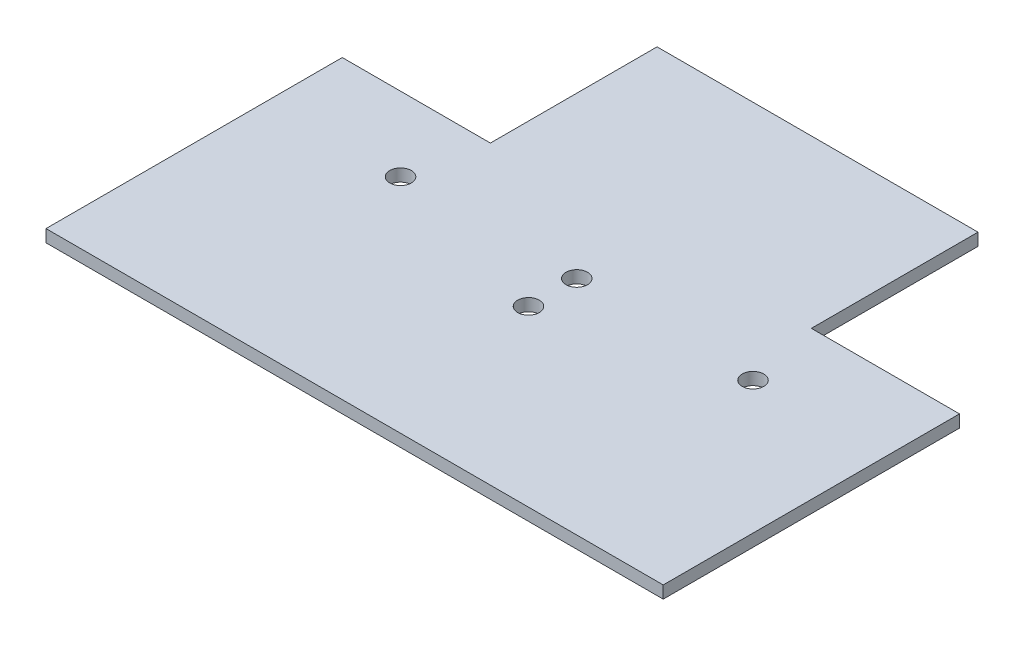
ISO-10303-21;
HEADER;
FILE_DESCRIPTION(('STEP AP214'),'2;1');
FILE_NAME('part.step','',(''),(''),'','','');
FILE_SCHEMA(('AUTOMOTIVE_DESIGN { 1 0 10303 214 1 1 1 1 }'));
ENDSEC;
DATA;
#1=APPLICATION_CONTEXT('core data for automotive mechanical design processes');
#2=APPLICATION_PROTOCOL_DEFINITION('international standard','automotive_design',2000,#1);
#3=PRODUCT_CONTEXT('',#1,'mechanical');
#4=PRODUCT('Part','Part','',(#3));
#5=PRODUCT_RELATED_PRODUCT_CATEGORY('part','',(#4));
#6=PRODUCT_DEFINITION_FORMATION('','',#4);
#7=PRODUCT_DEFINITION_CONTEXT('part definition',#1,'design');
#8=PRODUCT_DEFINITION('design','',#6,#7);
#9=PRODUCT_DEFINITION_SHAPE('','',#8);
#10=(LENGTH_UNIT() NAMED_UNIT(*) SI_UNIT(.MILLI.,.METRE.));
#11=(NAMED_UNIT(*) PLANE_ANGLE_UNIT() SI_UNIT($,.RADIAN.));
#12=(NAMED_UNIT(*) SI_UNIT($,.STERADIAN.) SOLID_ANGLE_UNIT());
#13=UNCERTAINTY_MEASURE_WITH_UNIT(LENGTH_MEASURE(1.E-05),#10,'distance_accuracy_value','');
#14=(GEOMETRIC_REPRESENTATION_CONTEXT(3) GLOBAL_UNCERTAINTY_ASSIGNED_CONTEXT((#13)) GLOBAL_UNIT_ASSIGNED_CONTEXT((#10,
#11,#12)) REPRESENTATION_CONTEXT('',''));
#15=CARTESIAN_POINT('',(0.,0.,0.));
#16=DIRECTION('',(0.,0.,1.));
#17=DIRECTION('',(1.,0.,0.));
#18=AXIS2_PLACEMENT_3D('',#15,#16,#17);
#19=CARTESIAN_POINT('',(50.,2.,0.));
#20=DIRECTION('',(1.,0.,0.));
#21=DIRECTION('',(0.,0.,-1.));
#22=AXIS2_PLACEMENT_3D('',#19,#20,#21);
#23=PLANE('',#22);
#24=DIRECTION('',(0.,0.,1.));
#25=VECTOR('',#24,1.);
#26=CARTESIAN_POINT('',(50.,0.,0.));
#27=LINE('',#26,#25);
#28=CARTESIAN_POINT('',(50.,0.,-10.5));
#29=VERTEX_POINT('',#28);
#30=CARTESIAN_POINT('',(50.,0.,37.5));
#31=VERTEX_POINT('',#30);
#32=EDGE_CURVE('E162',#29,#31,#27,.T.);
#33=ORIENTED_EDGE('',*,*,#32,.F.);
#34=DIRECTION('',(0.,-1.,0.));
#35=VECTOR('',#34,1.);
#36=CARTESIAN_POINT('',(50.,2.,-10.5));
#37=LINE('',#36,#35);
#38=CARTESIAN_POINT('',(50.,2.,-10.5));
#39=VERTEX_POINT('',#38);
#40=EDGE_CURVE('E11',#39,#29,#37,.T.);
#41=ORIENTED_EDGE('',*,*,#40,.F.);
#42=DIRECTION('',(0.,0.,1.));
#43=VECTOR('',#42,1.);
#44=CARTESIAN_POINT('',(50.,2.,0.));
#45=LINE('',#44,#43);
#46=CARTESIAN_POINT('',(50.,2.,37.5));
#47=VERTEX_POINT('',#46);
#48=EDGE_CURVE('E359',#39,#47,#45,.T.);
#49=ORIENTED_EDGE('',*,*,#48,.T.);
#50=DIRECTION('',(0.,-1.,0.));
#51=VECTOR('',#50,1.);
#52=CARTESIAN_POINT('',(50.,2.,37.5));
#53=LINE('',#52,#51);
#54=EDGE_CURVE('E94',#47,#31,#53,.T.);
#55=ORIENTED_EDGE('',*,*,#54,.T.);
#56=EDGE_LOOP('',(#33,#41,#49,#55));
#57=FACE_BOUND('',#56,.T.);
#58=ADVANCED_FACE('F41',(#57),#23,.T.);
#59=CARTESIAN_POINT('',(0.,2.,-10.5));
#60=DIRECTION('',(0.,0.,1.));
#61=DIRECTION('',(1.,0.,0.));
#62=AXIS2_PLACEMENT_3D('',#59,#60,#61);
#63=PLANE('',#62);
#64=DIRECTION('',(-1.,0.,0.));
#65=VECTOR('',#64,1.);
#66=CARTESIAN_POINT('',(0.,0.,-10.5));
#67=LINE('',#66,#65);
#68=CARTESIAN_POINT('',(26.,0.,-10.5));
#69=VERTEX_POINT('',#68);
#70=EDGE_CURVE('E165',#29,#69,#67,.T.);
#71=ORIENTED_EDGE('',*,*,#70,.T.);
#72=DIRECTION('',(0.,-1.,0.));
#73=VECTOR('',#72,1.);
#74=CARTESIAN_POINT('',(26.,2.,-10.5));
#75=LINE('',#74,#73);
#76=CARTESIAN_POINT('',(26.,2.,-10.5));
#77=VERTEX_POINT('',#76);
#78=EDGE_CURVE('E51',#77,#69,#75,.T.);
#79=ORIENTED_EDGE('',*,*,#78,.F.);
#80=DIRECTION('',(-1.,0.,0.));
#81=VECTOR('',#80,1.);
#82=CARTESIAN_POINT('',(0.,2.,-10.5));
#83=LINE('',#82,#81);
#84=EDGE_CURVE('E354',#39,#77,#83,.T.);
#85=ORIENTED_EDGE('',*,*,#84,.F.);
#86=ORIENTED_EDGE('',*,*,#40,.T.);
#87=EDGE_LOOP('',(#71,#79,#85,#86));
#88=FACE_BOUND('',#87,.T.);
#89=ADVANCED_FACE('F210',(#88),#63,.F.);
#90=CARTESIAN_POINT('',(26.,2.,0.));
#91=DIRECTION('',(-1.,0.,0.));
#92=DIRECTION('',(0.,0.,1.));
#93=AXIS2_PLACEMENT_3D('',#90,#91,#92);
#94=PLANE('',#93);
#95=DIRECTION('',(0.,0.,-1.));
#96=VECTOR('',#95,1.);
#97=CARTESIAN_POINT('',(26.,0.,0.));
#98=LINE('',#97,#96);
#99=CARTESIAN_POINT('',(26.,0.,-37.5));
#100=VERTEX_POINT('',#99);
#101=EDGE_CURVE('E169',#69,#100,#98,.T.);
#102=ORIENTED_EDGE('',*,*,#101,.T.);
#103=DIRECTION('',(0.,-1.,0.));
#104=VECTOR('',#103,1.);
#105=CARTESIAN_POINT('',(26.,2.,-37.5));
#106=LINE('',#105,#104);
#107=CARTESIAN_POINT('',(26.,2.,-37.5));
#108=VERTEX_POINT('',#107);
#109=EDGE_CURVE('E198',#108,#100,#106,.T.);
#110=ORIENTED_EDGE('',*,*,#109,.F.);
#111=DIRECTION('',(0.,0.,-1.));
#112=VECTOR('',#111,1.);
#113=CARTESIAN_POINT('',(26.,2.,0.));
#114=LINE('',#113,#112);
#115=EDGE_CURVE('E206',#77,#108,#114,.T.);
#116=ORIENTED_EDGE('',*,*,#115,.F.);
#117=ORIENTED_EDGE('',*,*,#78,.T.);
#118=EDGE_LOOP('',(#102,#110,#116,#117));
#119=FACE_BOUND('',#118,.T.);
#120=ADVANCED_FACE('F204',(#119),#94,.F.);
#121=CARTESIAN_POINT('',(0.,2.,-37.5));
#122=DIRECTION('',(0.,0.,-1.));
#123=DIRECTION('',(-1.,0.,0.));
#124=AXIS2_PLACEMENT_3D('',#121,#122,#123);
#125=PLANE('',#124);
#126=DIRECTION('',(1.,0.,0.));
#127=VECTOR('',#126,1.);
#128=CARTESIAN_POINT('',(0.,0.,-37.5));
#129=LINE('',#128,#127);
#130=CARTESIAN_POINT('',(-26.,0.,-37.5));
#131=VERTEX_POINT('',#130);
#132=EDGE_CURVE('E173',#131,#100,#129,.T.);
#133=ORIENTED_EDGE('',*,*,#132,.F.);
#134=DIRECTION('',(0.,-1.,0.));
#135=VECTOR('',#134,1.);
#136=CARTESIAN_POINT('',(-26.,2.,-37.5));
#137=LINE('',#136,#135);
#138=CARTESIAN_POINT('',(-26.,2.,-37.5));
#139=VERTEX_POINT('',#138);
#140=EDGE_CURVE('E195',#139,#131,#137,.T.);
#141=ORIENTED_EDGE('',*,*,#140,.F.);
#142=DIRECTION('',(1.,0.,0.));
#143=VECTOR('',#142,1.);
#144=CARTESIAN_POINT('',(0.,2.,-37.5));
#145=LINE('',#144,#143);
#146=EDGE_CURVE('E140',#139,#108,#145,.T.);
#147=ORIENTED_EDGE('',*,*,#146,.T.);
#148=ORIENTED_EDGE('',*,*,#109,.T.);
#149=EDGE_LOOP('',(#133,#141,#147,#148));
#150=FACE_BOUND('',#149,.T.);
#151=ADVANCED_FACE('F266',(#150),#125,.T.);
#152=CARTESIAN_POINT('',(-26.,2.,0.));
#153=DIRECTION('',(-1.,0.,0.));
#154=DIRECTION('',(0.,0.,1.));
#155=AXIS2_PLACEMENT_3D('',#152,#153,#154);
#156=PLANE('',#155);
#157=DIRECTION('',(0.,0.,-1.));
#158=VECTOR('',#157,1.);
#159=CARTESIAN_POINT('',(-26.,0.,0.));
#160=LINE('',#159,#158);
#161=CARTESIAN_POINT('',(-26.,0.,-10.5));
#162=VERTEX_POINT('',#161);
#163=EDGE_CURVE('E177',#162,#131,#160,.T.);
#164=ORIENTED_EDGE('',*,*,#163,.F.);
#165=DIRECTION('',(0.,-1.,0.));
#166=VECTOR('',#165,1.);
#167=CARTESIAN_POINT('',(-26.,2.,-10.5));
#168=LINE('',#167,#166);
#169=CARTESIAN_POINT('',(-26.,2.,-10.5));
#170=VERTEX_POINT('',#169);
#171=EDGE_CURVE('E124',#170,#162,#168,.T.);
#172=ORIENTED_EDGE('',*,*,#171,.F.);
#173=DIRECTION('',(0.,0.,-1.));
#174=VECTOR('',#173,1.);
#175=CARTESIAN_POINT('',(-26.,2.,0.));
#176=LINE('',#175,#174);
#177=EDGE_CURVE('E136',#170,#139,#176,.T.);
#178=ORIENTED_EDGE('',*,*,#177,.T.);
#179=ORIENTED_EDGE('',*,*,#140,.T.);
#180=EDGE_LOOP('',(#164,#172,#178,#179));
#181=FACE_BOUND('',#180,.T.);
#182=ADVANCED_FACE('F263',(#181),#156,.T.);
#183=CARTESIAN_POINT('',(0.,2.,-10.5));
#184=DIRECTION('',(0.,0.,-1.));
#185=DIRECTION('',(-1.,0.,0.));
#186=AXIS2_PLACEMENT_3D('',#183,#184,#185);
#187=PLANE('',#186);
#188=DIRECTION('',(1.,0.,0.));
#189=VECTOR('',#188,1.);
#190=CARTESIAN_POINT('',(0.,0.,-10.5));
#191=LINE('',#190,#189);
#192=CARTESIAN_POINT('',(-50.,0.,-10.5));
#193=VERTEX_POINT('',#192);
#194=EDGE_CURVE('E120',#193,#162,#191,.T.);
#195=ORIENTED_EDGE('',*,*,#194,.F.);
#196=DIRECTION('',(0.,-1.,0.));
#197=VECTOR('',#196,1.);
#198=CARTESIAN_POINT('',(-50.,2.,-10.5));
#199=LINE('',#198,#197);
#200=CARTESIAN_POINT('',(-50.,2.,-10.5));
#201=VERTEX_POINT('',#200);
#202=EDGE_CURVE('E114',#201,#193,#199,.T.);
#203=ORIENTED_EDGE('',*,*,#202,.F.);
#204=DIRECTION('',(1.,0.,0.));
#205=VECTOR('',#204,1.);
#206=CARTESIAN_POINT('',(0.,2.,-10.5));
#207=LINE('',#206,#205);
#208=EDGE_CURVE('E118',#201,#170,#207,.T.);
#209=ORIENTED_EDGE('',*,*,#208,.T.);
#210=ORIENTED_EDGE('',*,*,#171,.T.);
#211=EDGE_LOOP('',(#195,#203,#209,#210));
#212=FACE_BOUND('',#211,.T.);
#213=ADVANCED_FACE('F116',(#212),#187,.T.);
#214=CARTESIAN_POINT('',(-50.,2.,0.));
#215=DIRECTION('',(1.,0.,0.));
#216=DIRECTION('',(0.,0.,-1.));
#217=AXIS2_PLACEMENT_3D('',#214,#215,#216);
#218=PLANE('',#217);
#219=DIRECTION('',(0.,0.,1.));
#220=VECTOR('',#219,1.);
#221=CARTESIAN_POINT('',(-50.,0.,0.));
#222=LINE('',#221,#220);
#223=CARTESIAN_POINT('',(-50.,0.,37.5));
#224=VERTEX_POINT('',#223);
#225=EDGE_CURVE('E183',#193,#224,#222,.T.);
#226=ORIENTED_EDGE('',*,*,#225,.T.);
#227=DIRECTION('',(0.,-1.,0.));
#228=VECTOR('',#227,1.);
#229=CARTESIAN_POINT('',(-50.,2.,37.5));
#230=LINE('',#229,#228);
#231=CARTESIAN_POINT('',(-50.,2.,37.5));
#232=VERTEX_POINT('',#231);
#233=EDGE_CURVE('E125',#232,#224,#230,.T.);
#234=ORIENTED_EDGE('',*,*,#233,.F.);
#235=DIRECTION('',(0.,0.,1.));
#236=VECTOR('',#235,1.);
#237=CARTESIAN_POINT('',(-50.,2.,0.));
#238=LINE('',#237,#236);
#239=EDGE_CURVE('E128',#201,#232,#238,.T.);
#240=ORIENTED_EDGE('',*,*,#239,.F.);
#241=ORIENTED_EDGE('',*,*,#202,.T.);
#242=EDGE_LOOP('',(#226,#234,#240,#241));
#243=FACE_BOUND('',#242,.T.);
#244=ADVANCED_FACE('F129',(#243),#218,.F.);
#245=CARTESIAN_POINT('',(28.5500000000003,2.,1.50405140920961));
#246=DIRECTION('',(0.,-1.,0.));
#247=DIRECTION('',(0.,0.,-1.));
#248=AXIS2_PLACEMENT_3D('',#245,#246,#247);
#249=CYLINDRICAL_SURFACE('',#248,1.75);
#250=CARTESIAN_POINT('',(28.5500000000003,2.,1.50405140920961));
#251=DIRECTION('',(0.,1.,0.));
#252=DIRECTION('',(0.,0.,1.));
#253=AXIS2_PLACEMENT_3D('',#250,#251,#252);
#254=CIRCLE('',#253,1.75);
#255=CARTESIAN_POINT('',(28.5500000000003,2.,3.25405140920961));
#256=VERTEX_POINT('',#255);
#257=EDGE_CURVE('E362',#256,#256,#254,.T.);
#258=ORIENTED_EDGE('',*,*,#257,.T.);
#259=EDGE_LOOP('',(#258));
#260=FACE_BOUND('',#259,.T.);
#261=CARTESIAN_POINT('',(28.5500000000003,0.,1.50405140920961));
#262=DIRECTION('',(0.,1.,0.));
#263=DIRECTION('',(0.,0.,1.));
#264=AXIS2_PLACEMENT_3D('',#261,#262,#263);
#265=CIRCLE('',#264,1.75);
#266=CARTESIAN_POINT('',(28.5500000000003,0.,3.25405140920961));
#267=VERTEX_POINT('',#266);
#268=EDGE_CURVE('E158',#267,#267,#265,.T.);
#269=ORIENTED_EDGE('',*,*,#268,.F.);
#270=EDGE_LOOP('',(#269));
#271=FACE_BOUND('',#270,.T.);
#272=ADVANCED_FACE('F220',(#260,#271),#249,.F.);
#273=CARTESIAN_POINT('',(-28.5499999999995,2.,1.50405140920921));
#274=DIRECTION('',(0.,-1.,0.));
#275=DIRECTION('',(0.,0.,-1.));
#276=AXIS2_PLACEMENT_3D('',#273,#274,#275);
#277=CYLINDRICAL_SURFACE('',#276,1.75);
#278=CARTESIAN_POINT('',(-28.5499999999995,2.,1.50405140920921));
#279=DIRECTION('',(0.,1.,0.));
#280=DIRECTION('',(0.,0.,1.));
#281=AXIS2_PLACEMENT_3D('',#278,#279,#280);
#282=CIRCLE('',#281,1.75);
#283=CARTESIAN_POINT('',(-28.5499999999995,2.,3.25405140920921));
#284=VERTEX_POINT('',#283);
#285=EDGE_CURVE('E366',#284,#284,#282,.T.);
#286=ORIENTED_EDGE('',*,*,#285,.T.);
#287=EDGE_LOOP('',(#286));
#288=FACE_BOUND('',#287,.T.);
#289=CARTESIAN_POINT('',(-28.5499999999995,0.,1.50405140920921));
#290=DIRECTION('',(0.,1.,0.));
#291=DIRECTION('',(0.,0.,1.));
#292=AXIS2_PLACEMENT_3D('',#289,#290,#291);
#293=CIRCLE('',#292,1.75);
#294=CARTESIAN_POINT('',(-28.5499999999995,0.,3.25405140920921));
#295=VERTEX_POINT('',#294);
#296=EDGE_CURVE('E154',#295,#295,#293,.T.);
#297=ORIENTED_EDGE('',*,*,#296,.F.);
#298=EDGE_LOOP('',(#297));
#299=FACE_BOUND('',#298,.T.);
#300=ADVANCED_FACE('F223',(#288,#299),#277,.F.);
#301=CARTESIAN_POINT('',(-7.33373621660486E-13,2.,1.50405140920949));
#302=DIRECTION('',(0.,-1.,0.));
#303=DIRECTION('',(0.,0.,-1.));
#304=AXIS2_PLACEMENT_3D('',#301,#302,#303);
#305=CYLINDRICAL_SURFACE('',#304,1.75);
#306=CARTESIAN_POINT('',(-7.33373621660486E-13,2.,1.50405140920949));
#307=DIRECTION('',(0.,1.,0.));
#308=DIRECTION('',(0.,0.,1.));
#309=AXIS2_PLACEMENT_3D('',#306,#307,#308);
#310=CIRCLE('',#309,1.75);
#311=CARTESIAN_POINT('',(-7.33373621660486E-13,2.,3.25405140920949));
#312=VERTEX_POINT('',#311);
#313=EDGE_CURVE('E238',#312,#312,#310,.T.);
#314=ORIENTED_EDGE('',*,*,#313,.T.);
#315=EDGE_LOOP('',(#314));
#316=FACE_BOUND('',#315,.T.);
#317=CARTESIAN_POINT('',(-7.33373621660486E-13,0.,1.50405140920949));
#318=DIRECTION('',(0.,1.,0.));
#319=DIRECTION('',(0.,0.,1.));
#320=AXIS2_PLACEMENT_3D('',#317,#318,#319);
#321=CIRCLE('',#320,1.75);
#322=CARTESIAN_POINT('',(-7.33373621660486E-13,0.,3.25405140920949));
#323=VERTEX_POINT('',#322);
#324=EDGE_CURVE('E150',#323,#323,#321,.T.);
#325=ORIENTED_EDGE('',*,*,#324,.F.);
#326=EDGE_LOOP('',(#325));
#327=FACE_BOUND('',#326,.T.);
#328=ADVANCED_FACE('F226',(#316,#327),#305,.F.);
#329=CARTESIAN_POINT('',(-7.88016939159167E-13,2.,9.32928548546922));
#330=DIRECTION('',(0.,-1.,0.));
#331=DIRECTION('',(0.,0.,-1.));
#332=AXIS2_PLACEMENT_3D('',#329,#330,#331);
#333=CYLINDRICAL_SURFACE('',#332,1.75);
#334=CARTESIAN_POINT('',(-7.88016939159167E-13,2.,9.32928548546922));
#335=DIRECTION('',(0.,1.,0.));
#336=DIRECTION('',(0.,0.,1.));
#337=AXIS2_PLACEMENT_3D('',#334,#335,#336);
#338=CIRCLE('',#337,1.75);
#339=CARTESIAN_POINT('',(-7.88016939159167E-13,2.,11.0792854854692));
#340=VERTEX_POINT('',#339);
#341=EDGE_CURVE('E188',#340,#340,#338,.T.);
#342=ORIENTED_EDGE('',*,*,#341,.T.);
#343=EDGE_LOOP('',(#342));
#344=FACE_BOUND('',#343,.T.);
#345=CARTESIAN_POINT('',(-7.88016939159167E-13,0.,9.32928548546922));
#346=DIRECTION('',(0.,1.,0.));
#347=DIRECTION('',(0.,0.,1.));
#348=AXIS2_PLACEMENT_3D('',#345,#346,#347);
#349=CIRCLE('',#348,1.75);
#350=CARTESIAN_POINT('',(-7.88016939159167E-13,0.,11.0792854854692));
#351=VERTEX_POINT('',#350);
#352=EDGE_CURVE('E146',#351,#351,#349,.T.);
#353=ORIENTED_EDGE('',*,*,#352,.F.);
#354=EDGE_LOOP('',(#353));
#355=FACE_BOUND('',#354,.T.);
#356=ADVANCED_FACE('F43',(#344,#355),#333,.F.);
#357=CARTESIAN_POINT('',(0.,2.,37.5));
#358=DIRECTION('',(0.,0.,-1.));
#359=DIRECTION('',(-1.,0.,0.));
#360=AXIS2_PLACEMENT_3D('',#357,#358,#359);
#361=PLANE('',#360);
#362=DIRECTION('',(1.,0.,0.));
#363=VECTOR('',#362,1.);
#364=CARTESIAN_POINT('',(0.,0.,37.5));
#365=LINE('',#364,#363);
#366=EDGE_CURVE('E87',#224,#31,#365,.T.);
#367=ORIENTED_EDGE('',*,*,#366,.T.);
#368=ORIENTED_EDGE('',*,*,#54,.F.);
#369=DIRECTION('',(1.,0.,0.));
#370=VECTOR('',#369,1.);
#371=CARTESIAN_POINT('',(0.,2.,37.5));
#372=LINE('',#371,#370);
#373=EDGE_CURVE('E59',#232,#47,#372,.T.);
#374=ORIENTED_EDGE('',*,*,#373,.F.);
#375=ORIENTED_EDGE('',*,*,#233,.T.);
#376=EDGE_LOOP('',(#367,#368,#374,#375));
#377=FACE_BOUND('',#376,.T.);
#378=ADVANCED_FACE('F233',(#377),#361,.F.);
#379=CARTESIAN_POINT('',(0.,2.,0.));
#380=DIRECTION('',(0.,1.,0.));
#381=DIRECTION('',(0.,0.,1.));
#382=AXIS2_PLACEMENT_3D('',#379,#380,#381);
#383=PLANE('',#382);
#384=ORIENTED_EDGE('',*,*,#341,.F.);
#385=EDGE_LOOP('',(#384));
#386=FACE_BOUND('',#385,.T.);
#387=ORIENTED_EDGE('',*,*,#313,.F.);
#388=EDGE_LOOP('',(#387));
#389=FACE_BOUND('',#388,.T.);
#390=ORIENTED_EDGE('',*,*,#285,.F.);
#391=EDGE_LOOP('',(#390));
#392=FACE_BOUND('',#391,.T.);
#393=ORIENTED_EDGE('',*,*,#257,.F.);
#394=EDGE_LOOP('',(#393));
#395=FACE_BOUND('',#394,.T.);
#396=ORIENTED_EDGE('',*,*,#48,.F.);
#397=ORIENTED_EDGE('',*,*,#84,.T.);
#398=ORIENTED_EDGE('',*,*,#115,.T.);
#399=ORIENTED_EDGE('',*,*,#146,.F.);
#400=ORIENTED_EDGE('',*,*,#177,.F.);
#401=ORIENTED_EDGE('',*,*,#208,.F.);
#402=ORIENTED_EDGE('',*,*,#239,.T.);
#403=ORIENTED_EDGE('',*,*,#373,.T.);
#404=EDGE_LOOP('',(#396,#397,#398,#399,#400,#401,#402,#403));
#405=FACE_BOUND('',#404,.T.);
#406=ADVANCED_FACE('F133',(#386,#389,#392,#395,#405),#383,.T.);
#407=CARTESIAN_POINT('',(0.,0.,0.));
#408=DIRECTION('',(0.,1.,0.));
#409=DIRECTION('',(0.,0.,1.));
#410=AXIS2_PLACEMENT_3D('',#407,#408,#409);
#411=PLANE('',#410);
#412=ORIENTED_EDGE('',*,*,#352,.T.);
#413=EDGE_LOOP('',(#412));
#414=FACE_BOUND('',#413,.T.);
#415=ORIENTED_EDGE('',*,*,#324,.T.);
#416=EDGE_LOOP('',(#415));
#417=FACE_BOUND('',#416,.T.);
#418=ORIENTED_EDGE('',*,*,#296,.T.);
#419=EDGE_LOOP('',(#418));
#420=FACE_BOUND('',#419,.T.);
#421=ORIENTED_EDGE('',*,*,#268,.T.);
#422=EDGE_LOOP('',(#421));
#423=FACE_BOUND('',#422,.T.);
#424=ORIENTED_EDGE('',*,*,#32,.T.);
#425=ORIENTED_EDGE('',*,*,#366,.F.);
#426=ORIENTED_EDGE('',*,*,#225,.F.);
#427=ORIENTED_EDGE('',*,*,#194,.T.);
#428=ORIENTED_EDGE('',*,*,#163,.T.);
#429=ORIENTED_EDGE('',*,*,#132,.T.);
#430=ORIENTED_EDGE('',*,*,#101,.F.);
#431=ORIENTED_EDGE('',*,*,#70,.F.);
#432=EDGE_LOOP('',(#424,#425,#426,#427,#428,#429,#430,#431));
#433=FACE_BOUND('',#432,.T.);
#434=ADVANCED_FACE('F211',(#414,#417,#420,#423,#433),#411,.F.);
#435=CLOSED_SHELL('',(#58,#89,#120,#151,#182,#213,#244,#272,#300,#328,#356,#378,#406,#434));
#436=MANIFOLD_SOLID_BREP('B2',#435);
#437=ADVANCED_BREP_SHAPE_REPRESENTATION('',(#18,#436),#14);
#438=SHAPE_DEFINITION_REPRESENTATION(#9,#437);
ENDSEC;
END-ISO-10303-21;
